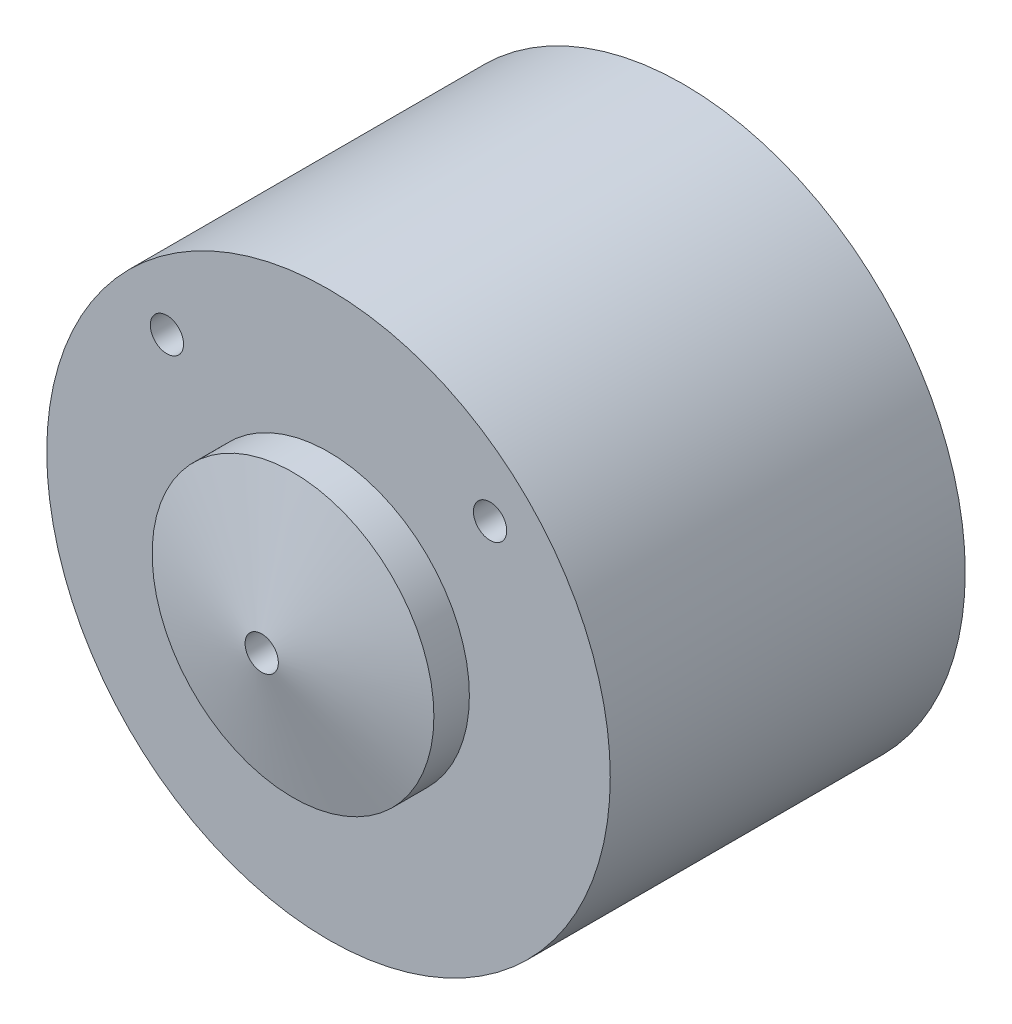
ISO-10303-21;
HEADER;
FILE_DESCRIPTION(('STEP AP214'),'2;1');
FILE_NAME('part.step','',(''),(''),'','','');
FILE_SCHEMA(('AUTOMOTIVE_DESIGN { 1 0 10303 214 1 1 1 1 }'));
ENDSEC;
DATA;
#1=APPLICATION_CONTEXT('core data for automotive mechanical design processes');
#2=APPLICATION_PROTOCOL_DEFINITION('international standard','automotive_design',2000,#1);
#3=PRODUCT_CONTEXT('',#1,'mechanical');
#4=PRODUCT('Part','Part','',(#3));
#5=PRODUCT_RELATED_PRODUCT_CATEGORY('part','',(#4));
#6=PRODUCT_DEFINITION_FORMATION('','',#4);
#7=PRODUCT_DEFINITION_CONTEXT('part definition',#1,'design');
#8=PRODUCT_DEFINITION('design','',#6,#7);
#9=PRODUCT_DEFINITION_SHAPE('','',#8);
#10=(LENGTH_UNIT() NAMED_UNIT(*) SI_UNIT(.MILLI.,.METRE.));
#11=(NAMED_UNIT(*) PLANE_ANGLE_UNIT() SI_UNIT($,.RADIAN.));
#12=(NAMED_UNIT(*) SI_UNIT($,.STERADIAN.) SOLID_ANGLE_UNIT());
#13=UNCERTAINTY_MEASURE_WITH_UNIT(LENGTH_MEASURE(1.E-05),#10,'distance_accuracy_value','');
#14=(GEOMETRIC_REPRESENTATION_CONTEXT(3) GLOBAL_UNCERTAINTY_ASSIGNED_CONTEXT((#13)) GLOBAL_UNIT_ASSIGNED_CONTEXT((#10,
#11,#12)) REPRESENTATION_CONTEXT('',''));
#15=CARTESIAN_POINT('',(0.,0.,0.));
#16=DIRECTION('',(0.,0.,1.));
#17=DIRECTION('',(1.,0.,0.));
#18=AXIS2_PLACEMENT_3D('',#15,#16,#17);
#19=CARTESIAN_POINT('',(0.,0.,16.));
#20=DIRECTION('',(0.,0.,1.));
#21=DIRECTION('',(1.,0.,0.));
#22=AXIS2_PLACEMENT_3D('',#19,#20,#21);
#23=PLANE('',#22);
#24=CARTESIAN_POINT('',(7.28319984622145,7.28319984622143,16.));
#25=DIRECTION('',(0.,0.,1.));
#26=DIRECTION('',(1.,0.,0.));
#27=AXIS2_PLACEMENT_3D('',#24,#25,#26);
#28=CIRCLE('',#27,0.749999999999999);
#29=CARTESIAN_POINT('',(8.03319984622145,7.28319984622143,16.));
#30=VERTEX_POINT('',#29);
#31=EDGE_CURVE('E56',#30,#30,#28,.F.);
#32=ORIENTED_EDGE('',*,*,#31,.T.);
#33=EDGE_LOOP('',(#32));
#34=FACE_BOUND('',#33,.T.);
#35=CARTESIAN_POINT('',(0.,0.,16.));
#36=DIRECTION('',(0.,0.,1.));
#37=DIRECTION('',(1.,0.,0.));
#38=AXIS2_PLACEMENT_3D('',#35,#36,#37);
#39=CIRCLE('',#38,12.7);
#40=CARTESIAN_POINT('',(12.7,0.,16.));
#41=VERTEX_POINT('',#40);
#42=EDGE_CURVE('E10',#41,#41,#39,.T.);
#43=ORIENTED_EDGE('',*,*,#42,.T.);
#44=EDGE_LOOP('',(#43));
#45=FACE_BOUND('',#44,.T.);
#46=CARTESIAN_POINT('',(0.,0.,16.));
#47=DIRECTION('',(0.,0.,1.));
#48=DIRECTION('',(1.,0.,0.));
#49=AXIS2_PLACEMENT_3D('',#46,#47,#48);
#50=CIRCLE('',#49,6.35);
#51=CARTESIAN_POINT('',(6.35,0.,16.));
#52=VERTEX_POINT('',#51);
#53=EDGE_CURVE('E48',#52,#52,#50,.T.);
#54=ORIENTED_EDGE('',*,*,#53,.F.);
#55=EDGE_LOOP('',(#54));
#56=FACE_BOUND('',#55,.T.);
#57=CARTESIAN_POINT('',(-7.28319984622145,7.28319984622143,16.));
#58=DIRECTION('',(0.,0.,1.));
#59=DIRECTION('',(1.,0.,0.));
#60=AXIS2_PLACEMENT_3D('',#57,#58,#59);
#61=CIRCLE('',#60,0.75);
#62=CARTESIAN_POINT('',(-6.53319984622145,7.28319984622143,16.));
#63=VERTEX_POINT('',#62);
#64=EDGE_CURVE('E62',#63,#63,#61,.F.);
#65=ORIENTED_EDGE('',*,*,#64,.T.);
#66=EDGE_LOOP('',(#65));
#67=FACE_BOUND('',#66,.T.);
#68=ADVANCED_FACE('F33',(#34,#45,#56,#67),#23,.T.);
#69=CARTESIAN_POINT('',(0.,0.,0.));
#70=DIRECTION('',(0.,0.,1.));
#71=DIRECTION('',(1.,0.,0.));
#72=AXIS2_PLACEMENT_3D('',#69,#70,#71);
#73=PLANE('',#72);
#74=CARTESIAN_POINT('',(7.28319984622145,7.28319984622143,0.));
#75=DIRECTION('',(0.,0.,1.));
#76=DIRECTION('',(1.,0.,0.));
#77=AXIS2_PLACEMENT_3D('',#74,#75,#76);
#78=CIRCLE('',#77,0.749999999999999);
#79=CARTESIAN_POINT('',(8.03319984622145,7.28319984622143,0.));
#80=VERTEX_POINT('',#79);
#81=EDGE_CURVE('E59',#80,#80,#78,.T.);
#82=ORIENTED_EDGE('',*,*,#81,.T.);
#83=EDGE_LOOP('',(#82));
#84=FACE_BOUND('',#83,.T.);
#85=CARTESIAN_POINT('',(0.,0.,0.));
#86=DIRECTION('',(0.,0.,1.));
#87=DIRECTION('',(1.,0.,0.));
#88=AXIS2_PLACEMENT_3D('',#85,#86,#87);
#89=CIRCLE('',#88,0.75);
#90=CARTESIAN_POINT('',(0.75,0.,0.));
#91=VERTEX_POINT('',#90);
#92=EDGE_CURVE('E53',#91,#91,#89,.T.);
#93=ORIENTED_EDGE('',*,*,#92,.T.);
#94=EDGE_LOOP('',(#93));
#95=FACE_BOUND('',#94,.T.);
#96=CARTESIAN_POINT('',(0.,0.,0.));
#97=DIRECTION('',(0.,0.,1.));
#98=DIRECTION('',(1.,0.,0.));
#99=AXIS2_PLACEMENT_3D('',#96,#97,#98);
#100=CIRCLE('',#99,12.7);
#101=CARTESIAN_POINT('',(12.7,0.,0.));
#102=VERTEX_POINT('',#101);
#103=EDGE_CURVE('E41',#102,#102,#100,.T.);
#104=ORIENTED_EDGE('',*,*,#103,.F.);
#105=EDGE_LOOP('',(#104));
#106=FACE_BOUND('',#105,.T.);
#107=CARTESIAN_POINT('',(-7.28319984622145,7.28319984622143,0.));
#108=DIRECTION('',(0.,0.,1.));
#109=DIRECTION('',(1.,0.,0.));
#110=AXIS2_PLACEMENT_3D('',#107,#108,#109);
#111=CIRCLE('',#110,0.75);
#112=CARTESIAN_POINT('',(-6.53319984622145,7.28319984622143,0.));
#113=VERTEX_POINT('',#112);
#114=EDGE_CURVE('E65',#113,#113,#111,.T.);
#115=ORIENTED_EDGE('',*,*,#114,.T.);
#116=EDGE_LOOP('',(#115));
#117=FACE_BOUND('',#116,.T.);
#118=ADVANCED_FACE('F69',(#84,#95,#106,#117),#73,.F.);
#119=CARTESIAN_POINT('',(0.,0.,16.));
#120=DIRECTION('',(0.,0.,-1.));
#121=DIRECTION('',(-1.,0.,0.));
#122=AXIS2_PLACEMENT_3D('',#119,#120,#121);
#123=CYLINDRICAL_SURFACE('',#122,12.7);
#124=ORIENTED_EDGE('',*,*,#42,.F.);
#125=EDGE_LOOP('',(#124));
#126=FACE_BOUND('',#125,.T.);
#127=ORIENTED_EDGE('',*,*,#103,.T.);
#128=EDGE_LOOP('',(#127));
#129=FACE_BOUND('',#128,.T.);
#130=ADVANCED_FACE('F35',(#126,#129),#123,.T.);
#131=CARTESIAN_POINT('',(0.,0.,17.6));
#132=DIRECTION('',(0.,0.,-1.));
#133=DIRECTION('',(-1.,0.,0.));
#134=AXIS2_PLACEMENT_3D('',#131,#132,#133);
#135=CYLINDRICAL_SURFACE('',#134,6.35);
#136=CARTESIAN_POINT('',(0.,0.,17.6));
#137=DIRECTION('',(0.,0.,1.));
#138=DIRECTION('',(1.,0.,0.));
#139=AXIS2_PLACEMENT_3D('',#136,#137,#138);
#140=CIRCLE('',#139,6.35);
#141=CARTESIAN_POINT('',(6.35000000000001,0.,17.6));
#142=VERTEX_POINT('',#141);
#143=EDGE_CURVE('E46',#142,#142,#140,.T.);
#144=ORIENTED_EDGE('',*,*,#143,.F.);
#145=EDGE_LOOP('',(#144));
#146=FACE_BOUND('',#145,.T.);
#147=ORIENTED_EDGE('',*,*,#53,.T.);
#148=EDGE_LOOP('',(#147));
#149=FACE_BOUND('',#148,.T.);
#150=ADVANCED_FACE('F91',(#146,#149),#135,.T.);
#151=CARTESIAN_POINT('',(0.,0.,17.6));
#152=DIRECTION('',(0.,0.,-1.));
#153=DIRECTION('',(1.,0.,0.));
#154=AXIS2_PLACEMENT_3D('',#151,#152,#153);
#155=CONICAL_SURFACE('',#154,6.35,1.32395441068534);
#156=CARTESIAN_POINT('',(0.,0.,19.0110915346663));
#157=DIRECTION('',(0.,0.,-1.));
#158=DIRECTION('',(-1.,0.,0.));
#159=AXIS2_PLACEMENT_3D('',#156,#157,#158);
#160=CIRCLE('',#159,0.75);
#161=CARTESIAN_POINT('',(0.749999999999987,0.,19.0110915346663));
#162=VERTEX_POINT('',#161);
#163=EDGE_CURVE('E37',#162,#162,#160,.T.);
#164=CARTESIAN_POINT('',(0.749999999999987,0.,19.0110915346663));
#165=CARTESIAN_POINT('',(0.80833333333332,0.,18.9963926645135));
#166=CARTESIAN_POINT('',(0.866666666666654,0.,18.9816937943608));
#167=CARTESIAN_POINT('',(0.983333333333321,0.,18.9522960540552));
#168=CARTESIAN_POINT('',(1.04166666666665,0.,18.9375971839024));
#169=CARTESIAN_POINT('',(1.15833333333332,0.,18.9081994435969));
#170=CARTESIAN_POINT('',(1.21666666666666,0.,18.8935005734441));
#171=CARTESIAN_POINT('',(1.33333333333332,0.,18.8641028331386));
#172=CARTESIAN_POINT('',(1.39166666666666,0.,18.8494039629858));
#173=CARTESIAN_POINT('',(1.50833333333332,0.,18.8200062226803));
#174=CARTESIAN_POINT('',(1.56666666666666,0.,18.8053073525275));
#175=CARTESIAN_POINT('',(1.68333333333332,0.,18.7759096122219));
#176=CARTESIAN_POINT('',(1.74166666666666,0.,18.7612107420692));
#177=CARTESIAN_POINT('',(1.85833333333332,0.,18.7318130017636));
#178=CARTESIAN_POINT('',(1.91666666666666,0.,18.7171141316108));
#179=CARTESIAN_POINT('',(2.03333333333332,0.,18.6877163913053));
#180=CARTESIAN_POINT('',(2.09166666666666,0.,18.6730175211525));
#181=CARTESIAN_POINT('',(2.20833333333333,0.,18.643619780847));
#182=CARTESIAN_POINT('',(2.26666666666666,0.,18.6289209106942));
#183=CARTESIAN_POINT('',(2.38333333333333,0.,18.5995231703886));
#184=CARTESIAN_POINT('',(2.44166666666666,0.,18.5848243002359));
#185=CARTESIAN_POINT('',(2.55833333333333,0.,18.5554265599303));
#186=CARTESIAN_POINT('',(2.61666666666666,0.,18.5407276897775));
#187=CARTESIAN_POINT('',(2.73333333333333,0.,18.511329949472));
#188=CARTESIAN_POINT('',(2.79166666666666,0.,18.4966310793192));
#189=CARTESIAN_POINT('',(2.90833333333333,0.,18.4672333390137));
#190=CARTESIAN_POINT('',(2.96666666666666,0.,18.4525344688609));
#191=CARTESIAN_POINT('',(3.08333333333333,0.,18.4231367285554));
#192=CARTESIAN_POINT('',(3.14166666666666,0.,18.4084378584026));
#193=CARTESIAN_POINT('',(3.25833333333333,0.,18.379040118097));
#194=CARTESIAN_POINT('',(3.31666666666666,0.,18.3643412479443));
#195=CARTESIAN_POINT('',(3.43333333333333,0.,18.3349435076387));
#196=CARTESIAN_POINT('',(3.49166666666666,0.,18.3202446374859));
#197=CARTESIAN_POINT('',(3.60833333333333,0.,18.2908468971804));
#198=CARTESIAN_POINT('',(3.66666666666666,0.,18.2761480270276));
#199=CARTESIAN_POINT('',(3.78333333333333,0.,18.2467502867221));
#200=CARTESIAN_POINT('',(3.84166666666666,0.,18.2320514165693));
#201=CARTESIAN_POINT('',(3.95833333333333,0.,18.2026536762637));
#202=CARTESIAN_POINT('',(4.01666666666666,0.,18.187954806111));
#203=CARTESIAN_POINT('',(4.13333333333333,0.,18.1585570658054));
#204=CARTESIAN_POINT('',(4.19166666666667,0.,18.1438581956526));
#205=CARTESIAN_POINT('',(4.30833333333333,0.,18.1144604553471));
#206=CARTESIAN_POINT('',(4.36666666666667,0.,18.0997615851943));
#207=CARTESIAN_POINT('',(4.48333333333333,0.,18.0703638448888));
#208=CARTESIAN_POINT('',(4.54166666666667,0.,18.055664974736));
#209=CARTESIAN_POINT('',(4.65833333333333,0.,18.0262672344304));
#210=CARTESIAN_POINT('',(4.71666666666667,0.,18.0115683642777));
#211=CARTESIAN_POINT('',(4.83333333333333,0.,17.9821706239721));
#212=CARTESIAN_POINT('',(4.89166666666667,0.,17.9674717538194));
#213=CARTESIAN_POINT('',(5.00833333333334,0.,17.9380740135138));
#214=CARTESIAN_POINT('',(5.06666666666667,0.,17.923375143361));
#215=CARTESIAN_POINT('',(5.18333333333334,0.,17.8939774030555));
#216=CARTESIAN_POINT('',(5.24166666666667,0.,17.8792785329027));
#217=CARTESIAN_POINT('',(5.35833333333334,0.,17.8498807925972));
#218=CARTESIAN_POINT('',(5.41666666666667,0.,17.8351819224444));
#219=CARTESIAN_POINT('',(5.53333333333334,0.,17.8057841821388));
#220=CARTESIAN_POINT('',(5.59166666666667,0.,17.7910853119861));
#221=CARTESIAN_POINT('',(5.70833333333334,0.,17.7616875716805));
#222=CARTESIAN_POINT('',(5.76666666666667,0.,17.7469887015277));
#223=CARTESIAN_POINT('',(5.88333333333334,0.,17.7175909612222));
#224=CARTESIAN_POINT('',(5.94166666666667,0.,17.7028920910694));
#225=CARTESIAN_POINT('',(6.05833333333334,0.,17.6734943507639));
#226=CARTESIAN_POINT('',(6.11666666666667,0.,17.6587954806111));
#227=CARTESIAN_POINT('',(6.23333333333334,0.,17.6293977403055));
#228=CARTESIAN_POINT('',(6.29166666666667,0.,17.6146988701528));
#229=CARTESIAN_POINT('',(6.35000000000001,0.,17.6));
#230=B_SPLINE_CURVE_WITH_KNOTS('',3,(#164,#165,#166,#167,#168,#169,#170,#171,#172,#173,#174,
#175,#176,#177,#178,#179,#180,#181,#182,#183,#184,#185,#186,#187,#188,#189,#190,#191,#192,#193,
#194,#195,#196,#197,#198,#199,#200,#201,#202,#203,#204,#205,#206,#207,#208,#209,#210,#211,#212,
#213,#214,#215,#216,#217,#218,#219,#220,#221,#222,#223,#224,#225,#226,#227,#228,#229),
.UNSPECIFIED.,.F.,.F.,(4,2,2,2,2,2,2,2,2,2,2,2,2,2,2,2,2,2,2,2,2,2,2,2,2,2,2,2,2,2,2,2,4),(0.,
0.180470249775173,0.360940499550346,0.54141074932552,0.721880999100692,0.902351248875863,
1.08282149865104,1.26329174842621,1.44376199820138,1.62423224797655,1.80470249775173,
1.9851727475269,2.16564299730207,2.34611324707725,2.52658349685242,2.70705374662759,
2.88752399640277,3.06799424617794,3.24846449595311,3.42893474572828,3.60940499550346,
3.78987524527863,3.9703454950538,4.15081574482898,4.33128599460415,4.51175624437932,
4.69222649415449,4.87269674392967,5.05316699370484,5.23363724348001,5.41410749325518,
5.59457774303036,5.77504799280553),.UNSPECIFIED.);
#231=EDGE_CURVE('BSEAM94',#162,#142,#230,.T.);
#232=ORIENTED_EDGE('',*,*,#163,.T.);
#233=ORIENTED_EDGE('',*,*,#143,.T.);
#234=ORIENTED_EDGE('',*,*,#231,.T.);
#235=ORIENTED_EDGE('',*,*,#231,.F.);
#236=EDGE_LOOP('',(#232,#234,#233,#235));
#237=FACE_BOUND('',#236,.T.);
#238=ADVANCED_FACE('F94',(#237),#155,.T.);
#239=CARTESIAN_POINT('',(0.,0.,0.));
#240=DIRECTION('',(0.,0.,1.));
#241=DIRECTION('',(1.,0.,0.));
#242=AXIS2_PLACEMENT_3D('',#239,#240,#241);
#243=CYLINDRICAL_SURFACE('',#242,0.75);
#244=ORIENTED_EDGE('',*,*,#92,.F.);
#245=EDGE_LOOP('',(#244));
#246=FACE_BOUND('',#245,.T.);
#247=ORIENTED_EDGE('',*,*,#163,.F.);
#248=EDGE_LOOP('',(#247));
#249=FACE_BOUND('',#248,.T.);
#250=ADVANCED_FACE('F79',(#246,#249),#243,.F.);
#251=CARTESIAN_POINT('',(7.28319984622145,7.28319984622143,19.0110915346663));
#252=DIRECTION('',(0.,0.,-1.));
#253=DIRECTION('',(-1.,0.,0.));
#254=AXIS2_PLACEMENT_3D('',#251,#252,#253);
#255=CYLINDRICAL_SURFACE('',#254,0.749999999999999);
#256=ORIENTED_EDGE('',*,*,#31,.F.);
#257=EDGE_LOOP('',(#256));
#258=FACE_BOUND('',#257,.T.);
#259=ORIENTED_EDGE('',*,*,#81,.F.);
#260=EDGE_LOOP('',(#259));
#261=FACE_BOUND('',#260,.T.);
#262=ADVANCED_FACE('F73',(#258,#261),#255,.F.);
#263=CARTESIAN_POINT('',(-7.28319984622145,7.28319984622143,19.0110915346663));
#264=DIRECTION('',(0.,0.,-1.));
#265=DIRECTION('',(-1.,0.,0.));
#266=AXIS2_PLACEMENT_3D('',#263,#264,#265);
#267=CYLINDRICAL_SURFACE('',#266,0.75);
#268=ORIENTED_EDGE('',*,*,#64,.F.);
#269=EDGE_LOOP('',(#268));
#270=FACE_BOUND('',#269,.T.);
#271=ORIENTED_EDGE('',*,*,#114,.F.);
#272=EDGE_LOOP('',(#271));
#273=FACE_BOUND('',#272,.T.);
#274=ADVANCED_FACE('F71',(#270,#273),#267,.F.);
#275=CLOSED_SHELL('',(#68,#118,#130,#150,#238,#250,#262,#274));
#276=MANIFOLD_SOLID_BREP('B2',#275);
#277=ADVANCED_BREP_SHAPE_REPRESENTATION('',(#18,#276),#14);
#278=SHAPE_DEFINITION_REPRESENTATION(#9,#277);
ENDSEC;
END-ISO-10303-21;
